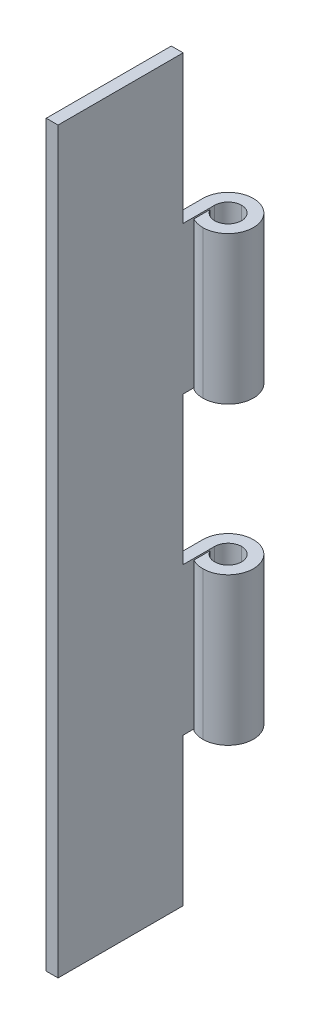
ISO-10303-21;
HEADER;
FILE_DESCRIPTION(('STEP AP214'),'2;1');
FILE_NAME('part.step','',(''),(''),'','','');
FILE_SCHEMA(('AUTOMOTIVE_DESIGN { 1 0 10303 214 1 1 1 1 }'));
ENDSEC;
DATA;
#1=APPLICATION_CONTEXT('core data for automotive mechanical design processes');
#2=APPLICATION_PROTOCOL_DEFINITION('international standard','automotive_design',2000,#1);
#3=PRODUCT_CONTEXT('',#1,'mechanical');
#4=PRODUCT('Part','Part','',(#3));
#5=PRODUCT_RELATED_PRODUCT_CATEGORY('part','',(#4));
#6=PRODUCT_DEFINITION_FORMATION('','',#4);
#7=PRODUCT_DEFINITION_CONTEXT('part definition',#1,'design');
#8=PRODUCT_DEFINITION('design','',#6,#7);
#9=PRODUCT_DEFINITION_SHAPE('','',#8);
#10=(LENGTH_UNIT() NAMED_UNIT(*) SI_UNIT(.MILLI.,.METRE.));
#11=(NAMED_UNIT(*) PLANE_ANGLE_UNIT() SI_UNIT($,.RADIAN.));
#12=(NAMED_UNIT(*) SI_UNIT($,.STERADIAN.) SOLID_ANGLE_UNIT());
#13=UNCERTAINTY_MEASURE_WITH_UNIT(LENGTH_MEASURE(1.E-05),#10,'distance_accuracy_value','');
#14=(GEOMETRIC_REPRESENTATION_CONTEXT(3) GLOBAL_UNCERTAINTY_ASSIGNED_CONTEXT((#13)) GLOBAL_UNIT_ASSIGNED_CONTEXT((#10,
#11,#12)) REPRESENTATION_CONTEXT('',''));
#15=CARTESIAN_POINT('',(0.,0.,0.));
#16=DIRECTION('',(0.,0.,1.));
#17=DIRECTION('',(1.,0.,0.));
#18=AXIS2_PLACEMENT_3D('',#15,#16,#17);
#19=CARTESIAN_POINT('',(4.3434,38.1,2.71018));
#20=DIRECTION('',(0.,-1.,0.));
#21=DIRECTION('',(0.,0.,-1.));
#22=AXIS2_PLACEMENT_3D('',#19,#20,#21);
#23=PLANE('',#22);
#24=CARTESIAN_POINT('',(2.1717,38.1,0.));
#25=DIRECTION('',(0.,-1.,0.));
#26=DIRECTION('',(0.,0.,-1.));
#27=AXIS2_PLACEMENT_3D('',#24,#25,#26);
#28=CIRCLE('',#27,2.1717);
#29=CARTESIAN_POINT('',(0.,38.1,0.));
#30=VERTEX_POINT('',#29);
#31=CARTESIAN_POINT('',(2.1717,38.1,-2.1717));
#32=VERTEX_POINT('',#31);
#33=EDGE_CURVE('E334',#30,#32,#28,.T.);
#34=ORIENTED_EDGE('',*,*,#33,.T.);
#35=CARTESIAN_POINT('',(2.1717,38.1,0.));
#36=DIRECTION('',(0.,-1.,0.));
#37=DIRECTION('',(0.,0.,-1.));
#38=AXIS2_PLACEMENT_3D('',#35,#36,#37);
#39=CIRCLE('',#38,2.1717);
#40=CARTESIAN_POINT('',(2.1717,38.1,2.1717));
#41=VERTEX_POINT('',#40);
#42=EDGE_CURVE('E304',#32,#41,#39,.T.);
#43=ORIENTED_EDGE('',*,*,#42,.T.);
#44=CARTESIAN_POINT('',(2.1717,38.1,0.));
#45=DIRECTION('',(0.,-1.,0.));
#46=DIRECTION('',(0.,0.,-1.));
#47=AXIS2_PLACEMENT_3D('',#44,#45,#46);
#48=CIRCLE('',#47,2.1717);
#49=CARTESIAN_POINT('',(1.143,38.1,1.9126048206569));
#50=VERTEX_POINT('',#49);
#51=EDGE_CURVE('E391',#41,#50,#48,.T.);
#52=ORIENTED_EDGE('',*,*,#51,.T.);
#53=DIRECTION('',(0.,0.,-1.));
#54=VECTOR('',#53,1.);
#55=CARTESIAN_POINT('',(1.143,38.1,0.526705610374527));
#56=LINE('',#55,#54);
#57=CARTESIAN_POINT('',(1.143,38.1,0.526705610374526));
#58=VERTEX_POINT('',#57);
#59=EDGE_CURVE('E378',#50,#58,#56,.T.);
#60=ORIENTED_EDGE('',*,*,#59,.T.);
#61=CARTESIAN_POINT('',(2.1717,38.1,0.));
#62=DIRECTION('',(0.,1.,0.));
#63=DIRECTION('',(0.,0.,-1.));
#64=AXIS2_PLACEMENT_3D('',#61,#62,#63);
#65=CIRCLE('',#64,1.1557);
#66=CARTESIAN_POINT('',(2.1717,38.1,1.1557));
#67=VERTEX_POINT('',#66);
#68=EDGE_CURVE('E343',#58,#67,#65,.T.);
#69=ORIENTED_EDGE('',*,*,#68,.T.);
#70=CARTESIAN_POINT('',(2.1717,38.1,0.));
#71=DIRECTION('',(0.,1.,0.));
#72=DIRECTION('',(0.,0.,-1.));
#73=AXIS2_PLACEMENT_3D('',#70,#71,#72);
#74=CIRCLE('',#73,1.1557);
#75=CARTESIAN_POINT('',(2.1717,38.1,-1.1557));
#76=VERTEX_POINT('',#75);
#77=EDGE_CURVE('E359',#67,#76,#74,.T.);
#78=ORIENTED_EDGE('',*,*,#77,.T.);
#79=CARTESIAN_POINT('',(2.1717,38.1,0.));
#80=DIRECTION('',(0.,1.,0.));
#81=DIRECTION('',(0.,0.,-1.));
#82=AXIS2_PLACEMENT_3D('',#79,#80,#81);
#83=CIRCLE('',#82,1.1557);
#84=CARTESIAN_POINT('',(1.016,38.1,0.));
#85=VERTEX_POINT('',#84);
#86=EDGE_CURVE('E353',#76,#85,#83,.T.);
#87=ORIENTED_EDGE('',*,*,#86,.T.);
#88=DIRECTION('',(0.,0.,1.));
#89=VECTOR('',#88,1.);
#90=CARTESIAN_POINT('',(1.016,38.1,13.462));
#91=LINE('',#90,#89);
#92=CARTESIAN_POINT('',(1.016,38.1,2.71018));
#93=VERTEX_POINT('',#92);
#94=EDGE_CURVE('E292',#85,#93,#91,.T.);
#95=ORIENTED_EDGE('',*,*,#94,.T.);
#96=DIRECTION('',(-1.,0.,0.));
#97=VECTOR('',#96,1.);
#98=CARTESIAN_POINT('',(4.3434,38.1,2.71018));
#99=LINE('',#98,#97);
#100=CARTESIAN_POINT('',(0.,38.1,2.71018));
#101=VERTEX_POINT('',#100);
#102=EDGE_CURVE('E11',#93,#101,#99,.T.);
#103=ORIENTED_EDGE('',*,*,#102,.T.);
#104=DIRECTION('',(0.,0.,1.));
#105=VECTOR('',#104,1.);
#106=CARTESIAN_POINT('',(0.,38.1,2.71018));
#107=LINE('',#106,#105);
#108=EDGE_CURVE('E281',#30,#101,#107,.T.);
#109=ORIENTED_EDGE('',*,*,#108,.F.);
#110=EDGE_LOOP('',(#34,#43,#52,#60,#69,#78,#87,#95,#103,#109));
#111=FACE_BOUND('',#110,.T.);
#112=ADVANCED_FACE('F38',(#111),#23,.T.);
#113=CARTESIAN_POINT('',(4.3434,25.4,2.71018));
#114=DIRECTION('',(0.,1.,0.));
#115=DIRECTION('',(1.,0.,0.));
#116=AXIS2_PLACEMENT_3D('',#113,#114,#115);
#117=PLANE('',#116);
#118=CARTESIAN_POINT('',(2.1717,25.4,0.));
#119=DIRECTION('',(0.,1.,0.));
#120=DIRECTION('',(0.,0.,1.));
#121=AXIS2_PLACEMENT_3D('',#118,#119,#120);
#122=CIRCLE('',#121,2.1717);
#123=CARTESIAN_POINT('',(1.143,25.4,1.9126048206569));
#124=VERTEX_POINT('',#123);
#125=CARTESIAN_POINT('',(2.1717,25.4,2.1717));
#126=VERTEX_POINT('',#125);
#127=EDGE_CURVE('E409',#124,#126,#122,.T.);
#128=ORIENTED_EDGE('',*,*,#127,.T.);
#129=CARTESIAN_POINT('',(2.1717,25.4,0.));
#130=DIRECTION('',(0.,1.,0.));
#131=DIRECTION('',(0.,0.,1.));
#132=AXIS2_PLACEMENT_3D('',#129,#130,#131);
#133=CIRCLE('',#132,2.1717);
#134=CARTESIAN_POINT('',(2.1717,25.4,-2.1717));
#135=VERTEX_POINT('',#134);
#136=EDGE_CURVE('E367',#126,#135,#133,.T.);
#137=ORIENTED_EDGE('',*,*,#136,.T.);
#138=CARTESIAN_POINT('',(2.1717,25.4,0.));
#139=DIRECTION('',(0.,1.,0.));
#140=DIRECTION('',(0.,0.,1.));
#141=AXIS2_PLACEMENT_3D('',#138,#139,#140);
#142=CIRCLE('',#141,2.1717);
#143=CARTESIAN_POINT('',(0.,25.4,0.));
#144=VERTEX_POINT('',#143);
#145=EDGE_CURVE('E272',#135,#144,#142,.T.);
#146=ORIENTED_EDGE('',*,*,#145,.T.);
#147=DIRECTION('',(0.,0.,-1.));
#148=VECTOR('',#147,1.);
#149=CARTESIAN_POINT('',(0.,25.4,2.71018));
#150=LINE('',#149,#148);
#151=CARTESIAN_POINT('',(0.,25.4,2.71018));
#152=VERTEX_POINT('',#151);
#153=EDGE_CURVE('E269',#152,#144,#150,.T.);
#154=ORIENTED_EDGE('',*,*,#153,.F.);
#155=DIRECTION('',(-1.,0.,0.));
#156=VECTOR('',#155,1.);
#157=CARTESIAN_POINT('',(4.3434,25.4,2.71018));
#158=LINE('',#157,#156);
#159=CARTESIAN_POINT('',(1.016,25.4,2.71018));
#160=VERTEX_POINT('',#159);
#161=EDGE_CURVE('E49',#160,#152,#158,.T.);
#162=ORIENTED_EDGE('',*,*,#161,.F.);
#163=DIRECTION('',(0.,0.,-1.));
#164=VECTOR('',#163,1.);
#165=CARTESIAN_POINT('',(1.016,25.4,13.462));
#166=LINE('',#165,#164);
#167=CARTESIAN_POINT('',(1.016,25.4,0.));
#168=VERTEX_POINT('',#167);
#169=EDGE_CURVE('E401',#160,#168,#166,.T.);
#170=ORIENTED_EDGE('',*,*,#169,.T.);
#171=CARTESIAN_POINT('',(2.1717,25.4,0.));
#172=DIRECTION('',(0.,-1.,0.));
#173=DIRECTION('',(0.,0.,1.));
#174=AXIS2_PLACEMENT_3D('',#171,#172,#173);
#175=CIRCLE('',#174,1.1557);
#176=CARTESIAN_POINT('',(2.1717,25.4,-1.1557));
#177=VERTEX_POINT('',#176);
#178=EDGE_CURVE('E493',#168,#177,#175,.T.);
#179=ORIENTED_EDGE('',*,*,#178,.T.);
#180=CARTESIAN_POINT('',(2.1717,25.4,0.));
#181=DIRECTION('',(0.,-1.,0.));
#182=DIRECTION('',(0.,0.,1.));
#183=AXIS2_PLACEMENT_3D('',#180,#181,#182);
#184=CIRCLE('',#183,1.1557);
#185=CARTESIAN_POINT('',(2.1717,25.4,1.1557));
#186=VERTEX_POINT('',#185);
#187=EDGE_CURVE('E417',#177,#186,#184,.T.);
#188=ORIENTED_EDGE('',*,*,#187,.T.);
#189=CARTESIAN_POINT('',(2.1717,25.4,0.));
#190=DIRECTION('',(0.,-1.,0.));
#191=DIRECTION('',(0.,0.,1.));
#192=AXIS2_PLACEMENT_3D('',#189,#190,#191);
#193=CIRCLE('',#192,1.1557);
#194=CARTESIAN_POINT('',(1.143,25.4,0.526705610374526));
#195=VERTEX_POINT('',#194);
#196=EDGE_CURVE('E363',#186,#195,#193,.T.);
#197=ORIENTED_EDGE('',*,*,#196,.T.);
#198=DIRECTION('',(0.,0.,1.));
#199=VECTOR('',#198,1.);
#200=CARTESIAN_POINT('',(1.143,25.4,0.526705610374527));
#201=LINE('',#200,#199);
#202=EDGE_CURVE('E372',#195,#124,#201,.T.);
#203=ORIENTED_EDGE('',*,*,#202,.T.);
#204=EDGE_LOOP('',(#128,#137,#146,#154,#162,#170,#179,#188,#197,#203));
#205=FACE_BOUND('',#204,.T.);
#206=ADVANCED_FACE('F270',(#205),#117,.T.);
#207=CARTESIAN_POINT('',(4.3434,38.1,2.71018));
#208=DIRECTION('',(0.,0.,-1.));
#209=DIRECTION('',(0.,-1.,0.));
#210=AXIS2_PLACEMENT_3D('',#207,#208,#209);
#211=PLANE('',#210);
#212=DIRECTION('',(0.,-1.,0.));
#213=VECTOR('',#212,1.);
#214=CARTESIAN_POINT('',(1.016,63.5,2.71018));
#215=LINE('',#214,#213);
#216=EDGE_CURVE('E262',#93,#160,#215,.T.);
#217=ORIENTED_EDGE('',*,*,#216,.T.);
#218=ORIENTED_EDGE('',*,*,#161,.T.);
#219=DIRECTION('',(0.,-1.,0.));
#220=VECTOR('',#219,1.);
#221=CARTESIAN_POINT('',(0.,38.1,2.71018));
#222=LINE('',#221,#220);
#223=EDGE_CURVE('E259',#101,#152,#222,.T.);
#224=ORIENTED_EDGE('',*,*,#223,.F.);
#225=ORIENTED_EDGE('',*,*,#102,.F.);
#226=EDGE_LOOP('',(#217,#218,#224,#225));
#227=FACE_BOUND('',#226,.T.);
#228=ADVANCED_FACE('F257',(#227),#211,.T.);
#229=CARTESIAN_POINT('',(4.3434,63.5,2.71018));
#230=DIRECTION('',(0.,0.,-1.));
#231=DIRECTION('',(0.,-1.,0.));
#232=AXIS2_PLACEMENT_3D('',#229,#230,#231);
#233=PLANE('',#232);
#234=DIRECTION('',(0.,-1.,0.));
#235=VECTOR('',#234,1.);
#236=CARTESIAN_POINT('',(1.016,63.5,2.71018));
#237=LINE('',#236,#235);
#238=CARTESIAN_POINT('',(1.016,63.5,2.71018));
#239=VERTEX_POINT('',#238);
#240=CARTESIAN_POINT('',(1.016,50.8,2.71018));
#241=VERTEX_POINT('',#240);
#242=EDGE_CURVE('E321',#239,#241,#237,.T.);
#243=ORIENTED_EDGE('',*,*,#242,.T.);
#244=DIRECTION('',(-1.,0.,0.));
#245=VECTOR('',#244,1.);
#246=CARTESIAN_POINT('',(4.3434,50.8,2.71018));
#247=LINE('',#246,#245);
#248=CARTESIAN_POINT('',(0.,50.8,2.71018));
#249=VERTEX_POINT('',#248);
#250=EDGE_CURVE('E146',#241,#249,#247,.T.);
#251=ORIENTED_EDGE('',*,*,#250,.T.);
#252=DIRECTION('',(0.,-1.,0.));
#253=VECTOR('',#252,1.);
#254=CARTESIAN_POINT('',(0.,63.5,2.71018));
#255=LINE('',#254,#253);
#256=CARTESIAN_POINT('',(0.,63.5,2.71018));
#257=VERTEX_POINT('',#256);
#258=EDGE_CURVE('E453',#257,#249,#255,.T.);
#259=ORIENTED_EDGE('',*,*,#258,.F.);
#260=DIRECTION('',(-1.,0.,0.));
#261=VECTOR('',#260,1.);
#262=CARTESIAN_POINT('',(2.1717,63.5,2.71018));
#263=LINE('',#262,#261);
#264=EDGE_CURVE('E134',#239,#257,#263,.T.);
#265=ORIENTED_EDGE('',*,*,#264,.F.);
#266=EDGE_LOOP('',(#243,#251,#259,#265));
#267=FACE_BOUND('',#266,.T.);
#268=ADVANCED_FACE('F604',(#267),#233,.T.);
#269=CARTESIAN_POINT('',(4.3434,50.8,2.71018));
#270=DIRECTION('',(0.,1.,0.));
#271=DIRECTION('',(1.,0.,0.));
#272=AXIS2_PLACEMENT_3D('',#269,#270,#271);
#273=PLANE('',#272);
#274=CARTESIAN_POINT('',(2.1717,50.8,0.));
#275=DIRECTION('',(0.,1.,0.));
#276=DIRECTION('',(0.,0.,1.));
#277=AXIS2_PLACEMENT_3D('',#274,#275,#276);
#278=CIRCLE('',#277,2.1717);
#279=CARTESIAN_POINT('',(1.143,50.8,1.9126048206569));
#280=VERTEX_POINT('',#279);
#281=CARTESIAN_POINT('',(2.1717,50.8,2.1717));
#282=VERTEX_POINT('',#281);
#283=EDGE_CURVE('E430',#280,#282,#278,.T.);
#284=ORIENTED_EDGE('',*,*,#283,.T.);
#285=CARTESIAN_POINT('',(2.1717,50.8,0.));
#286=DIRECTION('',(0.,1.,0.));
#287=DIRECTION('',(0.,0.,1.));
#288=AXIS2_PLACEMENT_3D('',#285,#286,#287);
#289=CIRCLE('',#288,2.1717);
#290=CARTESIAN_POINT('',(2.1717,50.8,-2.1717));
#291=VERTEX_POINT('',#290);
#292=EDGE_CURVE('E302',#282,#291,#289,.T.);
#293=ORIENTED_EDGE('',*,*,#292,.T.);
#294=CARTESIAN_POINT('',(2.1717,50.8,0.));
#295=DIRECTION('',(0.,1.,0.));
#296=DIRECTION('',(0.,0.,1.));
#297=AXIS2_PLACEMENT_3D('',#294,#295,#296);
#298=CIRCLE('',#297,2.1717);
#299=CARTESIAN_POINT('',(0.,50.8,0.));
#300=VERTEX_POINT('',#299);
#301=EDGE_CURVE('E338',#291,#300,#298,.T.);
#302=ORIENTED_EDGE('',*,*,#301,.T.);
#303=DIRECTION('',(0.,0.,-1.));
#304=VECTOR('',#303,1.);
#305=CARTESIAN_POINT('',(0.,50.8,2.71018));
#306=LINE('',#305,#304);
#307=EDGE_CURVE('E288',#249,#300,#306,.T.);
#308=ORIENTED_EDGE('',*,*,#307,.F.);
#309=ORIENTED_EDGE('',*,*,#250,.F.);
#310=DIRECTION('',(0.,0.,-1.));
#311=VECTOR('',#310,1.);
#312=CARTESIAN_POINT('',(1.016,50.8,13.462));
#313=LINE('',#312,#311);
#314=CARTESIAN_POINT('',(1.016,50.8,0.));
#315=VERTEX_POINT('',#314);
#316=EDGE_CURVE('E325',#241,#315,#313,.T.);
#317=ORIENTED_EDGE('',*,*,#316,.T.);
#318=CARTESIAN_POINT('',(2.1717,50.8,0.));
#319=DIRECTION('',(0.,-1.,0.));
#320=DIRECTION('',(0.,0.,1.));
#321=AXIS2_PLACEMENT_3D('',#318,#319,#320);
#322=CIRCLE('',#321,1.1557);
#323=CARTESIAN_POINT('',(2.1717,50.8,-1.1557));
#324=VERTEX_POINT('',#323);
#325=EDGE_CURVE('E358',#315,#324,#322,.T.);
#326=ORIENTED_EDGE('',*,*,#325,.T.);
#327=CARTESIAN_POINT('',(2.1717,50.8,0.));
#328=DIRECTION('',(0.,-1.,0.));
#329=DIRECTION('',(0.,0.,1.));
#330=AXIS2_PLACEMENT_3D('',#327,#328,#329);
#331=CIRCLE('',#330,1.1557);
#332=CARTESIAN_POINT('',(2.1717,50.8,1.1557));
#333=VERTEX_POINT('',#332);
#334=EDGE_CURVE('E345',#324,#333,#331,.T.);
#335=ORIENTED_EDGE('',*,*,#334,.T.);
#336=CARTESIAN_POINT('',(2.1717,50.8,0.));
#337=DIRECTION('',(0.,-1.,0.));
#338=DIRECTION('',(0.,0.,1.));
#339=AXIS2_PLACEMENT_3D('',#336,#337,#338);
#340=CIRCLE('',#339,1.1557);
#341=CARTESIAN_POINT('',(1.143,50.8,0.526705610374526));
#342=VERTEX_POINT('',#341);
#343=EDGE_CURVE('E344',#333,#342,#340,.T.);
#344=ORIENTED_EDGE('',*,*,#343,.T.);
#345=DIRECTION('',(0.,0.,1.));
#346=VECTOR('',#345,1.);
#347=CARTESIAN_POINT('',(1.143,50.8,0.526705610374527));
#348=LINE('',#347,#346);
#349=EDGE_CURVE('E375',#342,#280,#348,.T.);
#350=ORIENTED_EDGE('',*,*,#349,.T.);
#351=EDGE_LOOP('',(#284,#293,#302,#308,#309,#317,#326,#335,#344,#350));
#352=FACE_BOUND('',#351,.T.);
#353=ADVANCED_FACE('F595',(#352),#273,.T.);
#354=CARTESIAN_POINT('',(4.3434,12.7,2.71018));
#355=DIRECTION('',(0.,0.,-1.));
#356=DIRECTION('',(0.,-1.,0.));
#357=AXIS2_PLACEMENT_3D('',#354,#355,#356);
#358=PLANE('',#357);
#359=DIRECTION('',(0.,-1.,0.));
#360=VECTOR('',#359,1.);
#361=CARTESIAN_POINT('',(1.016,63.5,2.71018));
#362=LINE('',#361,#360);
#363=CARTESIAN_POINT('',(1.016,12.7,2.71018));
#364=VERTEX_POINT('',#363);
#365=CARTESIAN_POINT('',(1.016,0.,2.71018));
#366=VERTEX_POINT('',#365);
#367=EDGE_CURVE('E310',#364,#366,#362,.T.);
#368=ORIENTED_EDGE('',*,*,#367,.T.);
#369=DIRECTION('',(-1.,0.,0.));
#370=VECTOR('',#369,1.);
#371=CARTESIAN_POINT('',(2.1717,0.,2.71018));
#372=LINE('',#371,#370);
#373=CARTESIAN_POINT('',(0.,0.,2.71018));
#374=VERTEX_POINT('',#373);
#375=EDGE_CURVE('E405',#366,#374,#372,.T.);
#376=ORIENTED_EDGE('',*,*,#375,.T.);
#377=DIRECTION('',(0.,-1.,0.));
#378=VECTOR('',#377,1.);
#379=CARTESIAN_POINT('',(0.,12.7,2.71018));
#380=LINE('',#379,#378);
#381=CARTESIAN_POINT('',(0.,12.7,2.71018));
#382=VERTEX_POINT('',#381);
#383=EDGE_CURVE('E395',#382,#374,#380,.T.);
#384=ORIENTED_EDGE('',*,*,#383,.F.);
#385=DIRECTION('',(-1.,0.,0.));
#386=VECTOR('',#385,1.);
#387=CARTESIAN_POINT('',(4.3434,12.7,2.71018));
#388=LINE('',#387,#386);
#389=EDGE_CURVE('E381',#364,#382,#388,.T.);
#390=ORIENTED_EDGE('',*,*,#389,.F.);
#391=EDGE_LOOP('',(#368,#376,#384,#390));
#392=FACE_BOUND('',#391,.T.);
#393=ADVANCED_FACE('F554',(#392),#358,.T.);
#394=CARTESIAN_POINT('',(4.3434,12.7,2.71018));
#395=DIRECTION('',(0.,-1.,0.));
#396=DIRECTION('',(0.,0.,-1.));
#397=AXIS2_PLACEMENT_3D('',#394,#395,#396);
#398=PLANE('',#397);
#399=CARTESIAN_POINT('',(2.1717,12.7,0.));
#400=DIRECTION('',(0.,-1.,0.));
#401=DIRECTION('',(0.,0.,-1.));
#402=AXIS2_PLACEMENT_3D('',#399,#400,#401);
#403=CIRCLE('',#402,2.1717);
#404=CARTESIAN_POINT('',(0.,12.7,0.));
#405=VERTEX_POINT('',#404);
#406=CARTESIAN_POINT('',(2.1717,12.7,-2.1717));
#407=VERTEX_POINT('',#406);
#408=EDGE_CURVE('E444',#405,#407,#403,.T.);
#409=ORIENTED_EDGE('',*,*,#408,.T.);
#410=CARTESIAN_POINT('',(2.1717,12.7,0.));
#411=DIRECTION('',(0.,-1.,0.));
#412=DIRECTION('',(0.,0.,-1.));
#413=AXIS2_PLACEMENT_3D('',#410,#411,#412);
#414=CIRCLE('',#413,2.1717);
#415=CARTESIAN_POINT('',(2.1717,12.7,2.1717));
#416=VERTEX_POINT('',#415);
#417=EDGE_CURVE('E315',#407,#416,#414,.T.);
#418=ORIENTED_EDGE('',*,*,#417,.T.);
#419=CARTESIAN_POINT('',(2.1717,12.7,0.));
#420=DIRECTION('',(0.,-1.,0.));
#421=DIRECTION('',(0.,0.,-1.));
#422=AXIS2_PLACEMENT_3D('',#419,#420,#421);
#423=CIRCLE('',#422,2.1717);
#424=CARTESIAN_POINT('',(1.143,12.7,1.9126048206569));
#425=VERTEX_POINT('',#424);
#426=EDGE_CURVE('E483',#416,#425,#423,.T.);
#427=ORIENTED_EDGE('',*,*,#426,.T.);
#428=DIRECTION('',(0.,0.,-1.));
#429=VECTOR('',#428,1.);
#430=CARTESIAN_POINT('',(1.143,12.7,0.526705610374527));
#431=LINE('',#430,#429);
#432=CARTESIAN_POINT('',(1.143,12.7,0.526705610374526));
#433=VERTEX_POINT('',#432);
#434=EDGE_CURVE('E357',#425,#433,#431,.T.);
#435=ORIENTED_EDGE('',*,*,#434,.T.);
#436=CARTESIAN_POINT('',(2.1717,12.7,0.));
#437=DIRECTION('',(0.,1.,0.));
#438=DIRECTION('',(0.,0.,-1.));
#439=AXIS2_PLACEMENT_3D('',#436,#437,#438);
#440=CIRCLE('',#439,1.1557);
#441=CARTESIAN_POINT('',(2.1717,12.7,1.1557));
#442=VERTEX_POINT('',#441);
#443=EDGE_CURVE('E294',#433,#442,#440,.T.);
#444=ORIENTED_EDGE('',*,*,#443,.T.);
#445=CARTESIAN_POINT('',(2.1717,12.7,0.));
#446=DIRECTION('',(0.,1.,0.));
#447=DIRECTION('',(0.,0.,-1.));
#448=AXIS2_PLACEMENT_3D('',#445,#446,#447);
#449=CIRCLE('',#448,1.1557);
#450=CARTESIAN_POINT('',(2.1717,12.7,-1.1557));
#451=VERTEX_POINT('',#450);
#452=EDGE_CURVE('E298',#442,#451,#449,.T.);
#453=ORIENTED_EDGE('',*,*,#452,.T.);
#454=CARTESIAN_POINT('',(2.1717,12.7,0.));
#455=DIRECTION('',(0.,1.,0.));
#456=DIRECTION('',(0.,0.,-1.));
#457=AXIS2_PLACEMENT_3D('',#454,#455,#456);
#458=CIRCLE('',#457,1.1557);
#459=CARTESIAN_POINT('',(1.016,12.7,0.));
#460=VERTEX_POINT('',#459);
#461=EDGE_CURVE('E388',#451,#460,#458,.T.);
#462=ORIENTED_EDGE('',*,*,#461,.T.);
#463=DIRECTION('',(0.,0.,1.));
#464=VECTOR('',#463,1.);
#465=CARTESIAN_POINT('',(1.016,12.7,13.462));
#466=LINE('',#465,#464);
#467=EDGE_CURVE('E314',#460,#364,#466,.T.);
#468=ORIENTED_EDGE('',*,*,#467,.T.);
#469=ORIENTED_EDGE('',*,*,#389,.T.);
#470=DIRECTION('',(0.,0.,1.));
#471=VECTOR('',#470,1.);
#472=CARTESIAN_POINT('',(0.,12.7,2.71018));
#473=LINE('',#472,#471);
#474=EDGE_CURVE('E277',#405,#382,#473,.T.);
#475=ORIENTED_EDGE('',*,*,#474,.F.);
#476=EDGE_LOOP('',(#409,#418,#427,#435,#444,#453,#462,#468,#469,#475));
#477=FACE_BOUND('',#476,.T.);
#478=ADVANCED_FACE('F556',(#477),#398,.T.);
#479=CARTESIAN_POINT('',(0.,63.5,13.462));
#480=DIRECTION('',(0.,0.,-1.));
#481=DIRECTION('',(-1.,0.,0.));
#482=AXIS2_PLACEMENT_3D('',#479,#480,#481);
#483=PLANE('',#482);
#484=DIRECTION('',(1.,0.,0.));
#485=VECTOR('',#484,1.);
#486=CARTESIAN_POINT('',(0.,0.,13.462));
#487=LINE('',#486,#485);
#488=CARTESIAN_POINT('',(0.,0.,13.462));
#489=VERTEX_POINT('',#488);
#490=CARTESIAN_POINT('',(1.016,0.,13.462));
#491=VERTEX_POINT('',#490);
#492=EDGE_CURVE('E62',#489,#491,#487,.T.);
#493=ORIENTED_EDGE('',*,*,#492,.T.);
#494=DIRECTION('',(0.,-1.,0.));
#495=VECTOR('',#494,1.);
#496=CARTESIAN_POINT('',(1.016,63.5,13.462));
#497=LINE('',#496,#495);
#498=CARTESIAN_POINT('',(1.016,63.5,13.462));
#499=VERTEX_POINT('',#498);
#500=EDGE_CURVE('E333',#499,#491,#497,.T.);
#501=ORIENTED_EDGE('',*,*,#500,.F.);
#502=DIRECTION('',(1.,0.,0.));
#503=VECTOR('',#502,1.);
#504=CARTESIAN_POINT('',(0.,63.5,13.462));
#505=LINE('',#504,#503);
#506=CARTESIAN_POINT('',(0.,63.5,13.462));
#507=VERTEX_POINT('',#506);
#508=EDGE_CURVE('E402',#507,#499,#505,.T.);
#509=ORIENTED_EDGE('',*,*,#508,.F.);
#510=DIRECTION('',(0.,-1.,0.));
#511=VECTOR('',#510,1.);
#512=CARTESIAN_POINT('',(0.,63.5,13.462));
#513=LINE('',#512,#511);
#514=EDGE_CURVE('E326',#507,#489,#513,.T.);
#515=ORIENTED_EDGE('',*,*,#514,.T.);
#516=EDGE_LOOP('',(#493,#501,#509,#515));
#517=FACE_BOUND('',#516,.T.);
#518=ADVANCED_FACE('F545',(#517),#483,.F.);
#519=CARTESIAN_POINT('',(2.1717,0.,0.));
#520=DIRECTION('',(0.,1.,0.));
#521=DIRECTION('',(1.,0.,0.));
#522=AXIS2_PLACEMENT_3D('',#519,#520,#521);
#523=PLANE('',#522);
#524=ORIENTED_EDGE('',*,*,#375,.F.);
#525=DIRECTION('',(0.,0.,-1.));
#526=VECTOR('',#525,1.);
#527=CARTESIAN_POINT('',(1.016,0.,13.462));
#528=LINE('',#527,#526);
#529=EDGE_CURVE('E521',#491,#366,#528,.T.);
#530=ORIENTED_EDGE('',*,*,#529,.F.);
#531=ORIENTED_EDGE('',*,*,#492,.F.);
#532=DIRECTION('',(0.,0.,1.));
#533=VECTOR('',#532,1.);
#534=CARTESIAN_POINT('',(0.,0.,0.));
#535=LINE('',#534,#533);
#536=EDGE_CURVE('E330',#374,#489,#535,.T.);
#537=ORIENTED_EDGE('',*,*,#536,.F.);
#538=EDGE_LOOP('',(#524,#530,#531,#537));
#539=FACE_BOUND('',#538,.T.);
#540=ADVANCED_FACE('F552',(#539),#523,.F.);
#541=CARTESIAN_POINT('',(2.1717,63.5,0.));
#542=DIRECTION('',(0.,1.,0.));
#543=DIRECTION('',(1.,0.,0.));
#544=AXIS2_PLACEMENT_3D('',#541,#542,#543);
#545=PLANE('',#544);
#546=DIRECTION('',(0.,0.,-1.));
#547=VECTOR('',#546,1.);
#548=CARTESIAN_POINT('',(1.016,63.5,13.462));
#549=LINE('',#548,#547);
#550=EDGE_CURVE('E324',#499,#239,#549,.T.);
#551=ORIENTED_EDGE('',*,*,#550,.T.);
#552=ORIENTED_EDGE('',*,*,#264,.T.);
#553=DIRECTION('',(0.,0.,1.));
#554=VECTOR('',#553,1.);
#555=CARTESIAN_POINT('',(0.,63.5,0.));
#556=LINE('',#555,#554);
#557=EDGE_CURVE('E329',#257,#507,#556,.T.);
#558=ORIENTED_EDGE('',*,*,#557,.T.);
#559=ORIENTED_EDGE('',*,*,#508,.T.);
#560=EDGE_LOOP('',(#551,#552,#558,#559));
#561=FACE_BOUND('',#560,.T.);
#562=ADVANCED_FACE('F548',(#561),#545,.T.);
#563=CARTESIAN_POINT('',(1.143,63.5,0.526705610374527));
#564=DIRECTION('',(1.,0.,0.));
#565=DIRECTION('',(0.,0.,-1.));
#566=AXIS2_PLACEMENT_3D('',#563,#564,#565);
#567=PLANE('',#566);
#568=ORIENTED_EDGE('',*,*,#349,.F.);
#569=DIRECTION('',(0.,-1.,0.));
#570=VECTOR('',#569,1.);
#571=CARTESIAN_POINT('',(1.143,63.5,0.526705610374526));
#572=LINE('',#571,#570);
#573=EDGE_CURVE('E349',#342,#58,#572,.T.);
#574=ORIENTED_EDGE('',*,*,#573,.T.);
#575=ORIENTED_EDGE('',*,*,#59,.F.);
#576=DIRECTION('',(0.,-1.,0.));
#577=VECTOR('',#576,1.);
#578=CARTESIAN_POINT('',(1.143,63.5,1.9126048206569));
#579=LINE('',#578,#577);
#580=EDGE_CURVE('E396',#280,#50,#579,.T.);
#581=ORIENTED_EDGE('',*,*,#580,.F.);
#582=EDGE_LOOP('',(#568,#574,#575,#581));
#583=FACE_BOUND('',#582,.T.);
#584=ADVANCED_FACE('F630',(#583),#567,.F.);
#585=CARTESIAN_POINT('',(1.143,63.5,0.526705610374527));
#586=DIRECTION('',(1.,0.,0.));
#587=DIRECTION('',(0.,0.,-1.));
#588=AXIS2_PLACEMENT_3D('',#585,#586,#587);
#589=PLANE('',#588);
#590=ORIENTED_EDGE('',*,*,#434,.F.);
#591=DIRECTION('',(0.,-1.,0.));
#592=VECTOR('',#591,1.);
#593=CARTESIAN_POINT('',(1.143,63.5,1.9126048206569));
#594=LINE('',#593,#592);
#595=EDGE_CURVE('E412',#124,#425,#594,.T.);
#596=ORIENTED_EDGE('',*,*,#595,.F.);
#597=ORIENTED_EDGE('',*,*,#202,.F.);
#598=DIRECTION('',(0.,-1.,0.));
#599=VECTOR('',#598,1.);
#600=CARTESIAN_POINT('',(1.143,63.5,0.526705610374526));
#601=LINE('',#600,#599);
#602=EDGE_CURVE('E297',#195,#433,#601,.T.);
#603=ORIENTED_EDGE('',*,*,#602,.T.);
#604=EDGE_LOOP('',(#590,#596,#597,#603));
#605=FACE_BOUND('',#604,.T.);
#606=ADVANCED_FACE('F567',(#605),#589,.F.);
#607=CARTESIAN_POINT('',(2.1717,63.5,0.));
#608=DIRECTION('',(0.,-1.,0.));
#609=DIRECTION('',(0.,0.,-1.));
#610=AXIS2_PLACEMENT_3D('',#607,#608,#609);
#611=CYLINDRICAL_SURFACE('',#610,1.1557);
#612=DIRECTION('',(0.,-1.,0.));
#613=VECTOR('',#612,1.);
#614=CARTESIAN_POINT('',(2.1717,63.5,-1.1557));
#615=LINE('',#614,#613);
#616=EDGE_CURVE('E348',#324,#76,#615,.T.);
#617=ORIENTED_EDGE('',*,*,#616,.F.);
#618=ORIENTED_EDGE('',*,*,#325,.F.);
#619=DIRECTION('',(0.,-1.,0.));
#620=VECTOR('',#619,1.);
#621=CARTESIAN_POINT('',(1.016,63.5,0.));
#622=LINE('',#621,#620);
#623=EDGE_CURVE('E368',#315,#85,#622,.T.);
#624=ORIENTED_EDGE('',*,*,#623,.T.);
#625=ORIENTED_EDGE('',*,*,#86,.F.);
#626=EDGE_LOOP('',(#617,#618,#624,#625));
#627=FACE_BOUND('',#626,.T.);
#628=ADVANCED_FACE('F608',(#627),#611,.F.);
#629=CARTESIAN_POINT('',(2.1717,63.5,0.));
#630=DIRECTION('',(0.,-1.,0.));
#631=DIRECTION('',(0.,0.,-1.));
#632=AXIS2_PLACEMENT_3D('',#629,#630,#631);
#633=CYLINDRICAL_SURFACE('',#632,1.1557);
#634=DIRECTION('',(0.,-1.,0.));
#635=VECTOR('',#634,1.);
#636=CARTESIAN_POINT('',(2.1717,63.5,-1.1557));
#637=LINE('',#636,#635);
#638=EDGE_CURVE('E303',#177,#451,#637,.T.);
#639=ORIENTED_EDGE('',*,*,#638,.F.);
#640=ORIENTED_EDGE('',*,*,#178,.F.);
#641=DIRECTION('',(0.,-1.,0.));
#642=VECTOR('',#641,1.);
#643=CARTESIAN_POINT('',(1.016,63.5,0.));
#644=LINE('',#643,#642);
#645=EDGE_CURVE('E397',#168,#460,#644,.T.);
#646=ORIENTED_EDGE('',*,*,#645,.T.);
#647=ORIENTED_EDGE('',*,*,#461,.F.);
#648=EDGE_LOOP('',(#639,#640,#646,#647));
#649=FACE_BOUND('',#648,.T.);
#650=ADVANCED_FACE('F518',(#649),#633,.F.);
#651=CARTESIAN_POINT('',(1.016,63.5,13.462));
#652=DIRECTION('',(-1.,0.,0.));
#653=DIRECTION('',(0.,0.,1.));
#654=AXIS2_PLACEMENT_3D('',#651,#652,#653);
#655=PLANE('',#654);
#656=ORIENTED_EDGE('',*,*,#367,.F.);
#657=ORIENTED_EDGE('',*,*,#467,.F.);
#658=ORIENTED_EDGE('',*,*,#645,.F.);
#659=ORIENTED_EDGE('',*,*,#169,.F.);
#660=ORIENTED_EDGE('',*,*,#216,.F.);
#661=ORIENTED_EDGE('',*,*,#94,.F.);
#662=ORIENTED_EDGE('',*,*,#623,.F.);
#663=ORIENTED_EDGE('',*,*,#316,.F.);
#664=ORIENTED_EDGE('',*,*,#242,.F.);
#665=ORIENTED_EDGE('',*,*,#550,.F.);
#666=ORIENTED_EDGE('',*,*,#500,.T.);
#667=ORIENTED_EDGE('',*,*,#529,.T.);
#668=EDGE_LOOP('',(#656,#657,#658,#659,#660,#661,#662,#663,#664,#665,#666,#667));
#669=FACE_BOUND('',#668,.T.);
#670=ADVANCED_FACE('F510',(#669),#655,.F.);
#671=CARTESIAN_POINT('',(0.,63.5,0.));
#672=DIRECTION('',(1.,0.,0.));
#673=DIRECTION('',(0.,1.,0.));
#674=AXIS2_PLACEMENT_3D('',#671,#672,#673);
#675=PLANE('',#674);
#676=ORIENTED_EDGE('',*,*,#383,.T.);
#677=ORIENTED_EDGE('',*,*,#536,.T.);
#678=ORIENTED_EDGE('',*,*,#514,.F.);
#679=ORIENTED_EDGE('',*,*,#557,.F.);
#680=ORIENTED_EDGE('',*,*,#258,.T.);
#681=ORIENTED_EDGE('',*,*,#307,.T.);
#682=DIRECTION('',(0.,-1.,0.));
#683=VECTOR('',#682,1.);
#684=CARTESIAN_POINT('',(0.,63.5,0.));
#685=LINE('',#684,#683);
#686=EDGE_CURVE('E337',#300,#30,#685,.T.);
#687=ORIENTED_EDGE('',*,*,#686,.T.);
#688=ORIENTED_EDGE('',*,*,#108,.T.);
#689=ORIENTED_EDGE('',*,*,#223,.T.);
#690=ORIENTED_EDGE('',*,*,#153,.T.);
#691=DIRECTION('',(0.,-1.,0.));
#692=VECTOR('',#691,1.);
#693=CARTESIAN_POINT('',(0.,63.5,0.));
#694=LINE('',#693,#692);
#695=EDGE_CURVE('E413',#144,#405,#694,.T.);
#696=ORIENTED_EDGE('',*,*,#695,.T.);
#697=ORIENTED_EDGE('',*,*,#474,.T.);
#698=EDGE_LOOP('',(#676,#677,#678,#679,#680,#681,#687,#688,#689,#690,#696,#697));
#699=FACE_BOUND('',#698,.T.);
#700=ADVANCED_FACE('F279',(#699),#675,.F.);
#701=CARTESIAN_POINT('',(2.1717,63.5,0.));
#702=DIRECTION('',(0.,-1.,0.));
#703=DIRECTION('',(0.,0.,-1.));
#704=AXIS2_PLACEMENT_3D('',#701,#702,#703);
#705=CYLINDRICAL_SURFACE('',#704,2.1717);
#706=DIRECTION('',(0.,-1.,0.));
#707=VECTOR('',#706,1.);
#708=CARTESIAN_POINT('',(2.1717,63.5,2.1717));
#709=LINE('',#708,#707);
#710=EDGE_CURVE('E309',#282,#41,#709,.T.);
#711=ORIENTED_EDGE('',*,*,#710,.F.);
#712=ORIENTED_EDGE('',*,*,#283,.F.);
#713=ORIENTED_EDGE('',*,*,#580,.T.);
#714=ORIENTED_EDGE('',*,*,#51,.F.);
#715=EDGE_LOOP('',(#711,#712,#713,#714));
#716=FACE_BOUND('',#715,.T.);
#717=ADVANCED_FACE('F579',(#716),#705,.T.);
#718=CARTESIAN_POINT('',(2.1717,63.5,0.));
#719=DIRECTION('',(0.,-1.,0.));
#720=DIRECTION('',(0.,0.,-1.));
#721=AXIS2_PLACEMENT_3D('',#718,#719,#720);
#722=CYLINDRICAL_SURFACE('',#721,2.1717);
#723=DIRECTION('',(0.,-1.,0.));
#724=VECTOR('',#723,1.);
#725=CARTESIAN_POINT('',(2.1717,63.5,2.1717));
#726=LINE('',#725,#724);
#727=EDGE_CURVE('E320',#126,#416,#726,.T.);
#728=ORIENTED_EDGE('',*,*,#727,.F.);
#729=ORIENTED_EDGE('',*,*,#127,.F.);
#730=ORIENTED_EDGE('',*,*,#595,.T.);
#731=ORIENTED_EDGE('',*,*,#426,.F.);
#732=EDGE_LOOP('',(#728,#729,#730,#731));
#733=FACE_BOUND('',#732,.T.);
#734=ADVANCED_FACE('F569',(#733),#722,.T.);
#735=CARTESIAN_POINT('',(2.1717,63.5,0.));
#736=DIRECTION('',(0.,-1.,0.));
#737=DIRECTION('',(0.,0.,-1.));
#738=AXIS2_PLACEMENT_3D('',#735,#736,#737);
#739=CYLINDRICAL_SURFACE('',#738,2.1717);
#740=ORIENTED_EDGE('',*,*,#145,.F.);
#741=DIRECTION('',(0.,-1.,0.));
#742=VECTOR('',#741,1.);
#743=CARTESIAN_POINT('',(2.1717,63.5,-2.1717));
#744=LINE('',#743,#742);
#745=EDGE_CURVE('E319',#135,#407,#744,.T.);
#746=ORIENTED_EDGE('',*,*,#745,.T.);
#747=ORIENTED_EDGE('',*,*,#408,.F.);
#748=ORIENTED_EDGE('',*,*,#695,.F.);
#749=EDGE_LOOP('',(#740,#746,#747,#748));
#750=FACE_BOUND('',#749,.T.);
#751=ADVANCED_FACE('F570',(#750),#739,.T.);
#752=CARTESIAN_POINT('',(2.1717,63.5,0.));
#753=DIRECTION('',(0.,-1.,0.));
#754=DIRECTION('',(0.,0.,-1.));
#755=AXIS2_PLACEMENT_3D('',#752,#753,#754);
#756=CYLINDRICAL_SURFACE('',#755,2.1717);
#757=ORIENTED_EDGE('',*,*,#136,.F.);
#758=ORIENTED_EDGE('',*,*,#727,.T.);
#759=ORIENTED_EDGE('',*,*,#417,.F.);
#760=ORIENTED_EDGE('',*,*,#745,.F.);
#761=EDGE_LOOP('',(#757,#758,#759,#760));
#762=FACE_BOUND('',#761,.T.);
#763=ADVANCED_FACE('F468',(#762),#756,.T.);
#764=CARTESIAN_POINT('',(2.1717,63.5,0.));
#765=DIRECTION('',(0.,-1.,0.));
#766=DIRECTION('',(0.,0.,-1.));
#767=AXIS2_PLACEMENT_3D('',#764,#765,#766);
#768=CYLINDRICAL_SURFACE('',#767,2.1717);
#769=ORIENTED_EDGE('',*,*,#301,.F.);
#770=DIRECTION('',(0.,-1.,0.));
#771=VECTOR('',#770,1.);
#772=CARTESIAN_POINT('',(2.1717,63.5,-2.1717));
#773=LINE('',#772,#771);
#774=EDGE_CURVE('E308',#291,#32,#773,.T.);
#775=ORIENTED_EDGE('',*,*,#774,.T.);
#776=ORIENTED_EDGE('',*,*,#33,.F.);
#777=ORIENTED_EDGE('',*,*,#686,.F.);
#778=EDGE_LOOP('',(#769,#775,#776,#777));
#779=FACE_BOUND('',#778,.T.);
#780=ADVANCED_FACE('F577',(#779),#768,.T.);
#781=CARTESIAN_POINT('',(2.1717,63.5,0.));
#782=DIRECTION('',(0.,-1.,0.));
#783=DIRECTION('',(0.,0.,-1.));
#784=AXIS2_PLACEMENT_3D('',#781,#782,#783);
#785=CYLINDRICAL_SURFACE('',#784,2.1717);
#786=ORIENTED_EDGE('',*,*,#292,.F.);
#787=ORIENTED_EDGE('',*,*,#710,.T.);
#788=ORIENTED_EDGE('',*,*,#42,.F.);
#789=ORIENTED_EDGE('',*,*,#774,.F.);
#790=EDGE_LOOP('',(#786,#787,#788,#789));
#791=FACE_BOUND('',#790,.T.);
#792=ADVANCED_FACE('F598',(#791),#785,.T.);
#793=CARTESIAN_POINT('',(2.1717,63.5,0.));
#794=DIRECTION('',(0.,-1.,0.));
#795=DIRECTION('',(0.,0.,-1.));
#796=AXIS2_PLACEMENT_3D('',#793,#794,#795);
#797=CYLINDRICAL_SURFACE('',#796,1.1557);
#798=DIRECTION('',(0.,-1.,0.));
#799=VECTOR('',#798,1.);
#800=CARTESIAN_POINT('',(2.1717,63.5,1.1557));
#801=LINE('',#800,#799);
#802=EDGE_CURVE('E42',#186,#442,#801,.T.);
#803=ORIENTED_EDGE('',*,*,#802,.F.);
#804=ORIENTED_EDGE('',*,*,#187,.F.);
#805=ORIENTED_EDGE('',*,*,#638,.T.);
#806=ORIENTED_EDGE('',*,*,#452,.F.);
#807=EDGE_LOOP('',(#803,#804,#805,#806));
#808=FACE_BOUND('',#807,.T.);
#809=ADVANCED_FACE('F40',(#808),#797,.F.);
#810=CARTESIAN_POINT('',(2.1717,63.5,0.));
#811=DIRECTION('',(0.,-1.,0.));
#812=DIRECTION('',(0.,0.,-1.));
#813=AXIS2_PLACEMENT_3D('',#810,#811,#812);
#814=CYLINDRICAL_SURFACE('',#813,1.1557);
#815=ORIENTED_EDGE('',*,*,#196,.F.);
#816=ORIENTED_EDGE('',*,*,#802,.T.);
#817=ORIENTED_EDGE('',*,*,#443,.F.);
#818=ORIENTED_EDGE('',*,*,#602,.F.);
#819=EDGE_LOOP('',(#815,#816,#817,#818));
#820=FACE_BOUND('',#819,.T.);
#821=ADVANCED_FACE('F565',(#820),#814,.F.);
#822=CARTESIAN_POINT('',(2.1717,63.5,0.));
#823=DIRECTION('',(0.,-1.,0.));
#824=DIRECTION('',(0.,0.,-1.));
#825=AXIS2_PLACEMENT_3D('',#822,#823,#824);
#826=CYLINDRICAL_SURFACE('',#825,1.1557);
#827=DIRECTION('',(0.,-1.,0.));
#828=VECTOR('',#827,1.);
#829=CARTESIAN_POINT('',(2.1717,63.5,1.1557));
#830=LINE('',#829,#828);
#831=EDGE_CURVE('E339',#333,#67,#830,.T.);
#832=ORIENTED_EDGE('',*,*,#831,.F.);
#833=ORIENTED_EDGE('',*,*,#334,.F.);
#834=ORIENTED_EDGE('',*,*,#616,.T.);
#835=ORIENTED_EDGE('',*,*,#77,.F.);
#836=EDGE_LOOP('',(#832,#833,#834,#835));
#837=FACE_BOUND('',#836,.T.);
#838=ADVANCED_FACE('F591',(#837),#826,.F.);
#839=CARTESIAN_POINT('',(2.1717,63.5,0.));
#840=DIRECTION('',(0.,-1.,0.));
#841=DIRECTION('',(0.,0.,-1.));
#842=AXIS2_PLACEMENT_3D('',#839,#840,#841);
#843=CYLINDRICAL_SURFACE('',#842,1.1557);
#844=ORIENTED_EDGE('',*,*,#343,.F.);
#845=ORIENTED_EDGE('',*,*,#831,.T.);
#846=ORIENTED_EDGE('',*,*,#68,.F.);
#847=ORIENTED_EDGE('',*,*,#573,.F.);
#848=EDGE_LOOP('',(#844,#845,#846,#847));
#849=FACE_BOUND('',#848,.T.);
#850=ADVANCED_FACE('F588',(#849),#843,.F.);
#851=CLOSED_SHELL('',(#112,#206,#228,#268,#353,#393,#478,#518,#540,#562,#584,#606,#628,#650,
#670,#700,#717,#734,#751,#763,#780,#792,#809,#821,#838,#850));
#852=MANIFOLD_SOLID_BREP('B2',#851);
#853=ADVANCED_BREP_SHAPE_REPRESENTATION('',(#18,#852),#14);
#854=SHAPE_DEFINITION_REPRESENTATION(#9,#853);
ENDSEC;
END-ISO-10303-21;
